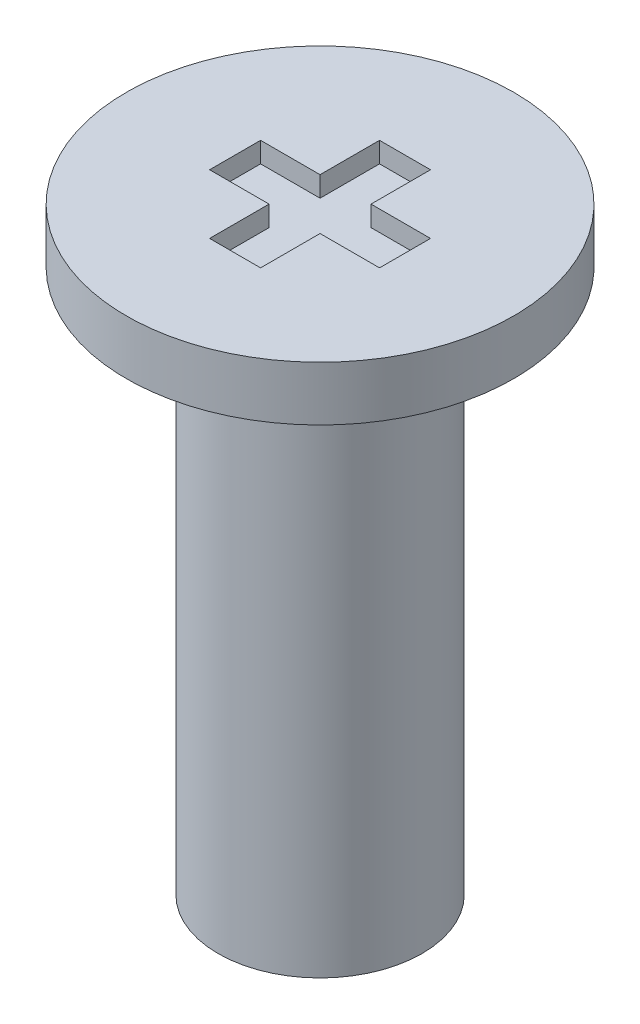
ISO-10303-21;
HEADER;
FILE_DESCRIPTION(('STEP AP214'),'2;1');
FILE_NAME('part.step','',(''),(''),'','','');
FILE_SCHEMA(('AUTOMOTIVE_DESIGN { 1 0 10303 214 1 1 1 1 }'));
ENDSEC;
DATA;
#1=APPLICATION_CONTEXT('core data for automotive mechanical design processes');
#2=APPLICATION_PROTOCOL_DEFINITION('international standard','automotive_design',2000,#1);
#3=PRODUCT_CONTEXT('',#1,'mechanical');
#4=PRODUCT('Part','Part','',(#3));
#5=PRODUCT_RELATED_PRODUCT_CATEGORY('part','',(#4));
#6=PRODUCT_DEFINITION_FORMATION('','',#4);
#7=PRODUCT_DEFINITION_CONTEXT('part definition',#1,'design');
#8=PRODUCT_DEFINITION('design','',#6,#7);
#9=PRODUCT_DEFINITION_SHAPE('','',#8);
#10=(LENGTH_UNIT() NAMED_UNIT(*) SI_UNIT(.MILLI.,.METRE.));
#11=(NAMED_UNIT(*) PLANE_ANGLE_UNIT() SI_UNIT($,.RADIAN.));
#12=(NAMED_UNIT(*) SI_UNIT($,.STERADIAN.) SOLID_ANGLE_UNIT());
#13=UNCERTAINTY_MEASURE_WITH_UNIT(LENGTH_MEASURE(1.E-05),#10,'distance_accuracy_value','');
#14=(GEOMETRIC_REPRESENTATION_CONTEXT(3) GLOBAL_UNCERTAINTY_ASSIGNED_CONTEXT((#13)) GLOBAL_UNIT_ASSIGNED_CONTEXT((#10,
#11,#12)) REPRESENTATION_CONTEXT('',''));
#15=CARTESIAN_POINT('',(0.,0.,0.));
#16=DIRECTION('',(0.,0.,1.));
#17=DIRECTION('',(1.,0.,0.));
#18=AXIS2_PLACEMENT_3D('',#15,#16,#17);
#19=CARTESIAN_POINT('',(0.,0.,0.));
#20=DIRECTION('',(0.,1.,0.));
#21=DIRECTION('',(0.,0.,1.));
#22=AXIS2_PLACEMENT_3D('',#19,#20,#21);
#23=PLANE('',#22);
#24=DIRECTION('',(-1.,0.,0.));
#25=VECTOR('',#24,1.);
#26=CARTESIAN_POINT('',(0.,0.,-0.375));
#27=LINE('',#26,#25);
#28=CARTESIAN_POINT('',(1.25,0.,-0.374999999999996));
#29=VERTEX_POINT('',#28);
#30=CARTESIAN_POINT('',(0.375,0.,-0.374999999999999));
#31=VERTEX_POINT('',#30);
#32=EDGE_CURVE('E222',#29,#31,#27,.T.);
#33=ORIENTED_EDGE('',*,*,#32,.F.);
#34=DIRECTION('',(0.,0.,-1.));
#35=VECTOR('',#34,1.);
#36=CARTESIAN_POINT('',(1.25,0.,-0.374999999999996));
#37=LINE('',#36,#35);
#38=CARTESIAN_POINT('',(1.25,0.,0.375000000000004));
#39=VERTEX_POINT('',#38);
#40=EDGE_CURVE('E149',#39,#29,#37,.T.);
#41=ORIENTED_EDGE('',*,*,#40,.F.);
#42=DIRECTION('',(1.,0.,0.));
#43=VECTOR('',#42,1.);
#44=CARTESIAN_POINT('',(0.,0.,0.375));
#45=LINE('',#44,#43);
#46=CARTESIAN_POINT('',(0.375,0.,0.375000000000004));
#47=VERTEX_POINT('',#46);
#48=EDGE_CURVE('E225',#47,#39,#45,.T.);
#49=ORIENTED_EDGE('',*,*,#48,.F.);
#50=DIRECTION('',(0.,0.,-1.));
#51=VECTOR('',#50,1.);
#52=CARTESIAN_POINT('',(0.375,0.,0.));
#53=LINE('',#52,#51);
#54=CARTESIAN_POINT('',(0.375,0.,1.25));
#55=VERTEX_POINT('',#54);
#56=EDGE_CURVE('E182',#55,#47,#53,.T.);
#57=ORIENTED_EDGE('',*,*,#56,.F.);
#58=DIRECTION('',(1.,0.,0.));
#59=VECTOR('',#58,1.);
#60=CARTESIAN_POINT('',(0.375,0.,1.25));
#61=LINE('',#60,#59);
#62=CARTESIAN_POINT('',(-0.375,0.,1.25));
#63=VERTEX_POINT('',#62);
#64=EDGE_CURVE('E187',#63,#55,#61,.T.);
#65=ORIENTED_EDGE('',*,*,#64,.F.);
#66=DIRECTION('',(0.,0.,1.));
#67=VECTOR('',#66,1.);
#68=CARTESIAN_POINT('',(-0.375,0.,0.));
#69=LINE('',#68,#67);
#70=CARTESIAN_POINT('',(-0.375,0.,0.374999999999996));
#71=VERTEX_POINT('',#70);
#72=EDGE_CURVE('E198',#71,#63,#69,.T.);
#73=ORIENTED_EDGE('',*,*,#72,.F.);
#74=DIRECTION('',(1.,0.,0.));
#75=VECTOR('',#74,1.);
#76=CARTESIAN_POINT('',(0.,0.,0.375));
#77=LINE('',#76,#75);
#78=CARTESIAN_POINT('',(-1.25,0.,0.374999999999987));
#79=VERTEX_POINT('',#78);
#80=EDGE_CURVE('E171',#79,#71,#77,.T.);
#81=ORIENTED_EDGE('',*,*,#80,.F.);
#82=DIRECTION('',(0.,0.,1.));
#83=VECTOR('',#82,1.);
#84=CARTESIAN_POINT('',(-1.25,0.,0.374999999999987));
#85=LINE('',#84,#83);
#86=CARTESIAN_POINT('',(-1.25,0.,-0.375000000000013));
#87=VERTEX_POINT('',#86);
#88=EDGE_CURVE('E168',#87,#79,#85,.T.);
#89=ORIENTED_EDGE('',*,*,#88,.F.);
#90=CARTESIAN_POINT('',(-0.375,0.,-0.375000000000001));
#91=VERTEX_POINT('',#90);
#92=EDGE_CURVE('E155',#91,#87,#27,.T.);
#93=ORIENTED_EDGE('',*,*,#92,.F.);
#94=DIRECTION('',(0.,0.,1.));
#95=VECTOR('',#94,1.);
#96=CARTESIAN_POINT('',(-0.375,0.,0.));
#97=LINE('',#96,#95);
#98=CARTESIAN_POINT('',(-0.375,0.,-1.25));
#99=VERTEX_POINT('',#98);
#100=EDGE_CURVE('E243',#99,#91,#97,.T.);
#101=ORIENTED_EDGE('',*,*,#100,.F.);
#102=DIRECTION('',(-1.,0.,0.));
#103=VECTOR('',#102,1.);
#104=CARTESIAN_POINT('',(-0.375,0.,-1.25));
#105=LINE('',#104,#103);
#106=CARTESIAN_POINT('',(0.375,0.,-1.25));
#107=VERTEX_POINT('',#106);
#108=EDGE_CURVE('E247',#107,#99,#105,.T.);
#109=ORIENTED_EDGE('',*,*,#108,.F.);
#110=DIRECTION('',(0.,0.,-1.));
#111=VECTOR('',#110,1.);
#112=CARTESIAN_POINT('',(0.375,0.,0.));
#113=LINE('',#112,#111);
#114=EDGE_CURVE('E74',#31,#107,#113,.T.);
#115=ORIENTED_EDGE('',*,*,#114,.F.);
#116=EDGE_LOOP('',(#33,#41,#49,#57,#65,#73,#81,#89,#93,#101,#109,#115));
#117=FACE_BOUND('',#116,.T.);
#118=CARTESIAN_POINT('',(0.,0.,0.));
#119=DIRECTION('',(0.,-1.,0.));
#120=DIRECTION('',(0.,0.,-1.));
#121=AXIS2_PLACEMENT_3D('',#118,#119,#120);
#122=CIRCLE('',#121,2.85);
#123=CARTESIAN_POINT('',(0.,0.,-2.85));
#124=VERTEX_POINT('',#123);
#125=EDGE_CURVE('E11',#124,#124,#122,.T.);
#126=ORIENTED_EDGE('',*,*,#125,.F.);
#127=EDGE_LOOP('',(#126));
#128=FACE_BOUND('',#127,.T.);
#129=ADVANCED_FACE('F45',(#117,#128),#23,.T.);
#130=CARTESIAN_POINT('',(0.,-8.8,0.));
#131=DIRECTION('',(0.,-1.,0.));
#132=DIRECTION('',(0.,0.,-1.));
#133=AXIS2_PLACEMENT_3D('',#130,#131,#132);
#134=CYLINDRICAL_SURFACE('',#133,2.85);
#135=ORIENTED_EDGE('',*,*,#125,.T.);
#136=EDGE_LOOP('',(#135));
#137=FACE_BOUND('',#136,.T.);
#138=CARTESIAN_POINT('',(0.,-0.8,0.));
#139=DIRECTION('',(0.,-1.,0.));
#140=DIRECTION('',(0.,0.,-1.));
#141=AXIS2_PLACEMENT_3D('',#138,#139,#140);
#142=CIRCLE('',#141,2.85);
#143=CARTESIAN_POINT('',(0.,-0.8,-2.85));
#144=VERTEX_POINT('',#143);
#145=EDGE_CURVE('E54',#144,#144,#142,.T.);
#146=ORIENTED_EDGE('',*,*,#145,.F.);
#147=EDGE_LOOP('',(#146));
#148=FACE_BOUND('',#147,.T.);
#149=ADVANCED_FACE('F279',(#137,#148),#134,.T.);
#150=CARTESIAN_POINT('',(2.85,-0.8,0.));
#151=DIRECTION('',(0.,-1.,0.));
#152=DIRECTION('',(0.,0.,-1.));
#153=AXIS2_PLACEMENT_3D('',#150,#151,#152);
#154=PLANE('',#153);
#155=ORIENTED_EDGE('',*,*,#145,.T.);
#156=EDGE_LOOP('',(#155));
#157=FACE_BOUND('',#156,.T.);
#158=CARTESIAN_POINT('',(0.,-0.8,0.));
#159=DIRECTION('',(0.,-1.,0.));
#160=DIRECTION('',(0.,0.,-1.));
#161=AXIS2_PLACEMENT_3D('',#158,#159,#160);
#162=CIRCLE('',#161,1.5);
#163=CARTESIAN_POINT('',(0.,-0.8,-1.5));
#164=VERTEX_POINT('',#163);
#165=EDGE_CURVE('E269',#164,#164,#162,.T.);
#166=ORIENTED_EDGE('',*,*,#165,.F.);
#167=EDGE_LOOP('',(#166));
#168=FACE_BOUND('',#167,.T.);
#169=ADVANCED_FACE('F276',(#157,#168),#154,.T.);
#170=CARTESIAN_POINT('',(0.,-8.8,0.));
#171=DIRECTION('',(0.,-1.,0.));
#172=DIRECTION('',(0.,0.,-1.));
#173=AXIS2_PLACEMENT_3D('',#170,#171,#172);
#174=CYLINDRICAL_SURFACE('',#173,1.5);
#175=ORIENTED_EDGE('',*,*,#165,.T.);
#176=EDGE_LOOP('',(#175));
#177=FACE_BOUND('',#176,.T.);
#178=CARTESIAN_POINT('',(0.,-8.8,0.));
#179=DIRECTION('',(0.,-1.,0.));
#180=DIRECTION('',(0.,0.,-1.));
#181=AXIS2_PLACEMENT_3D('',#178,#179,#180);
#182=CIRCLE('',#181,1.5);
#183=CARTESIAN_POINT('',(0.,-8.8,-1.5));
#184=VERTEX_POINT('',#183);
#185=EDGE_CURVE('E263',#184,#184,#182,.T.);
#186=ORIENTED_EDGE('',*,*,#185,.F.);
#187=EDGE_LOOP('',(#186));
#188=FACE_BOUND('',#187,.T.);
#189=ADVANCED_FACE('F286',(#177,#188),#174,.T.);
#190=CARTESIAN_POINT('',(1.5,-8.8,0.));
#191=DIRECTION('',(0.,-1.,0.));
#192=DIRECTION('',(0.,0.,-1.));
#193=AXIS2_PLACEMENT_3D('',#190,#191,#192);
#194=PLANE('',#193);
#195=ORIENTED_EDGE('',*,*,#185,.T.);
#196=EDGE_LOOP('',(#195));
#197=FACE_BOUND('',#196,.T.);
#198=ADVANCED_FACE('F292',(#197),#194,.T.);
#199=CARTESIAN_POINT('',(-0.375,-0.3,0.));
#200=DIRECTION('',(-1.,0.,0.));
#201=DIRECTION('',(0.,-1.,0.));
#202=AXIS2_PLACEMENT_3D('',#199,#200,#201);
#203=PLANE('',#202);
#204=ORIENTED_EDGE('',*,*,#100,.T.);
#205=DIRECTION('',(0.,-1.,0.));
#206=VECTOR('',#205,1.);
#207=CARTESIAN_POINT('',(-0.375,-0.3,-0.375000000000001));
#208=LINE('',#207,#206);
#209=CARTESIAN_POINT('',(-0.375,-0.3,-0.375000000000001));
#210=VERTEX_POINT('',#209);
#211=EDGE_CURVE('E240',#91,#210,#208,.T.);
#212=ORIENTED_EDGE('',*,*,#211,.T.);
#213=DIRECTION('',(0.,0.,1.));
#214=VECTOR('',#213,1.);
#215=CARTESIAN_POINT('',(-0.375,-0.3,0.));
#216=LINE('',#215,#214);
#217=CARTESIAN_POINT('',(-0.375,-0.3,-1.25));
#218=VERTEX_POINT('',#217);
#219=EDGE_CURVE('E146',#218,#210,#216,.T.);
#220=ORIENTED_EDGE('',*,*,#219,.F.);
#221=DIRECTION('',(0.,1.,0.));
#222=VECTOR('',#221,1.);
#223=CARTESIAN_POINT('',(-0.375,-0.3,-1.25));
#224=LINE('',#223,#222);
#225=EDGE_CURVE('E62',#218,#99,#224,.T.);
#226=ORIENTED_EDGE('',*,*,#225,.T.);
#227=EDGE_LOOP('',(#204,#212,#220,#226));
#228=FACE_BOUND('',#227,.T.);
#229=ADVANCED_FACE('F296',(#228),#203,.F.);
#230=CARTESIAN_POINT('',(-0.375,-0.3,-1.25));
#231=DIRECTION('',(0.,0.,-1.));
#232=DIRECTION('',(-1.,0.,0.));
#233=AXIS2_PLACEMENT_3D('',#230,#231,#232);
#234=PLANE('',#233);
#235=ORIENTED_EDGE('',*,*,#108,.T.);
#236=ORIENTED_EDGE('',*,*,#225,.F.);
#237=DIRECTION('',(-1.,0.,0.));
#238=VECTOR('',#237,1.);
#239=CARTESIAN_POINT('',(-0.375,-0.3,-1.25));
#240=LINE('',#239,#238);
#241=CARTESIAN_POINT('',(0.375,-0.3,-1.25));
#242=VERTEX_POINT('',#241);
#243=EDGE_CURVE('E250',#242,#218,#240,.T.);
#244=ORIENTED_EDGE('',*,*,#243,.F.);
#245=DIRECTION('',(0.,1.,0.));
#246=VECTOR('',#245,1.);
#247=CARTESIAN_POINT('',(0.375,-0.3,-1.25));
#248=LINE('',#247,#246);
#249=EDGE_CURVE('E253',#242,#107,#248,.T.);
#250=ORIENTED_EDGE('',*,*,#249,.T.);
#251=EDGE_LOOP('',(#235,#236,#244,#250));
#252=FACE_BOUND('',#251,.T.);
#253=ADVANCED_FACE('F300',(#252),#234,.F.);
#254=CARTESIAN_POINT('',(0.375,-0.3,0.));
#255=DIRECTION('',(1.,0.,0.));
#256=DIRECTION('',(0.,1.,0.));
#257=AXIS2_PLACEMENT_3D('',#254,#255,#256);
#258=PLANE('',#257);
#259=DIRECTION('',(0.,0.,-1.));
#260=VECTOR('',#259,1.);
#261=CARTESIAN_POINT('',(0.375,-0.3,0.));
#262=LINE('',#261,#260);
#263=CARTESIAN_POINT('',(0.375,-0.3,-0.374999999999999));
#264=VERTEX_POINT('',#263);
#265=EDGE_CURVE('E246',#264,#242,#262,.T.);
#266=ORIENTED_EDGE('',*,*,#265,.F.);
#267=DIRECTION('',(0.,1.,0.));
#268=VECTOR('',#267,1.);
#269=CARTESIAN_POINT('',(0.375,-0.3,-0.374999999999999));
#270=LINE('',#269,#268);
#271=EDGE_CURVE('E234',#264,#31,#270,.T.);
#272=ORIENTED_EDGE('',*,*,#271,.T.);
#273=ORIENTED_EDGE('',*,*,#114,.T.);
#274=ORIENTED_EDGE('',*,*,#249,.F.);
#275=EDGE_LOOP('',(#266,#272,#273,#274));
#276=FACE_BOUND('',#275,.T.);
#277=ADVANCED_FACE('F302',(#276),#258,.F.);
#278=CARTESIAN_POINT('',(0.,-0.3,0.));
#279=DIRECTION('',(0.,-1.,0.));
#280=DIRECTION('',(1.,0.,0.));
#281=AXIS2_PLACEMENT_3D('',#278,#279,#280);
#282=PLANE('',#281);
#283=DIRECTION('',(-1.,0.,0.));
#284=VECTOR('',#283,1.);
#285=CARTESIAN_POINT('',(0.,-0.3,-0.375));
#286=LINE('',#285,#284);
#287=CARTESIAN_POINT('',(1.25,-0.3,-0.374999999999996));
#288=VERTEX_POINT('',#287);
#289=EDGE_CURVE('E148',#288,#264,#286,.T.);
#290=ORIENTED_EDGE('',*,*,#289,.T.);
#291=ORIENTED_EDGE('',*,*,#265,.T.);
#292=ORIENTED_EDGE('',*,*,#243,.T.);
#293=ORIENTED_EDGE('',*,*,#219,.T.);
#294=CARTESIAN_POINT('',(-1.25,-0.3,-0.375000000000013));
#295=VERTEX_POINT('',#294);
#296=EDGE_CURVE('E82',#210,#295,#286,.T.);
#297=ORIENTED_EDGE('',*,*,#296,.T.);
#298=DIRECTION('',(0.,0.,1.));
#299=VECTOR('',#298,1.);
#300=CARTESIAN_POINT('',(-1.25,-0.3,0.374999999999987));
#301=LINE('',#300,#299);
#302=CARTESIAN_POINT('',(-1.25,-0.3,0.374999999999987));
#303=VERTEX_POINT('',#302);
#304=EDGE_CURVE('E144',#295,#303,#301,.T.);
#305=ORIENTED_EDGE('',*,*,#304,.T.);
#306=DIRECTION('',(1.,0.,0.));
#307=VECTOR('',#306,1.);
#308=CARTESIAN_POINT('',(0.,-0.3,0.375));
#309=LINE('',#308,#307);
#310=CARTESIAN_POINT('',(-0.375,-0.3,0.374999999999996));
#311=VERTEX_POINT('',#310);
#312=EDGE_CURVE('E165',#303,#311,#309,.T.);
#313=ORIENTED_EDGE('',*,*,#312,.T.);
#314=DIRECTION('',(0.,0.,1.));
#315=VECTOR('',#314,1.);
#316=CARTESIAN_POINT('',(-0.375,-0.3,0.));
#317=LINE('',#316,#315);
#318=CARTESIAN_POINT('',(-0.375,-0.3,1.25));
#319=VERTEX_POINT('',#318);
#320=EDGE_CURVE('E186',#311,#319,#317,.T.);
#321=ORIENTED_EDGE('',*,*,#320,.T.);
#322=DIRECTION('',(1.,0.,0.));
#323=VECTOR('',#322,1.);
#324=CARTESIAN_POINT('',(0.375,-0.3,1.25));
#325=LINE('',#324,#323);
#326=CARTESIAN_POINT('',(0.375,-0.3,1.25));
#327=VERTEX_POINT('',#326);
#328=EDGE_CURVE('E190',#319,#327,#325,.T.);
#329=ORIENTED_EDGE('',*,*,#328,.T.);
#330=DIRECTION('',(0.,0.,-1.));
#331=VECTOR('',#330,1.);
#332=CARTESIAN_POINT('',(0.375,-0.3,0.));
#333=LINE('',#332,#331);
#334=CARTESIAN_POINT('',(0.375,-0.3,0.375000000000004));
#335=VERTEX_POINT('',#334);
#336=EDGE_CURVE('E183',#327,#335,#333,.T.);
#337=ORIENTED_EDGE('',*,*,#336,.T.);
#338=DIRECTION('',(1.,0.,0.));
#339=VECTOR('',#338,1.);
#340=CARTESIAN_POINT('',(0.,-0.3,0.375));
#341=LINE('',#340,#339);
#342=CARTESIAN_POINT('',(1.25,-0.3,0.375000000000004));
#343=VERTEX_POINT('',#342);
#344=EDGE_CURVE('E214',#335,#343,#341,.T.);
#345=ORIENTED_EDGE('',*,*,#344,.T.);
#346=DIRECTION('',(0.,0.,-1.));
#347=VECTOR('',#346,1.);
#348=CARTESIAN_POINT('',(1.25,-0.3,-0.374999999999996));
#349=LINE('',#348,#347);
#350=EDGE_CURVE('E217',#343,#288,#349,.T.);
#351=ORIENTED_EDGE('',*,*,#350,.T.);
#352=EDGE_LOOP('',(#290,#291,#292,#293,#297,#305,#313,#321,#329,#337,#345,#351));
#353=FACE_BOUND('',#352,.T.);
#354=ADVANCED_FACE('F142',(#353),#282,.F.);
#355=CARTESIAN_POINT('',(0.,-0.3,-0.375));
#356=DIRECTION('',(0.,0.,-1.));
#357=DIRECTION('',(-1.,0.,0.));
#358=AXIS2_PLACEMENT_3D('',#355,#356,#357);
#359=PLANE('',#358);
#360=ORIENTED_EDGE('',*,*,#92,.T.);
#361=DIRECTION('',(0.,1.,0.));
#362=VECTOR('',#361,1.);
#363=CARTESIAN_POINT('',(-1.25,-0.3,-0.375000000000013));
#364=LINE('',#363,#362);
#365=EDGE_CURVE('E152',#295,#87,#364,.T.);
#366=ORIENTED_EDGE('',*,*,#365,.F.);
#367=ORIENTED_EDGE('',*,*,#296,.F.);
#368=ORIENTED_EDGE('',*,*,#211,.F.);
#369=EDGE_LOOP('',(#360,#366,#367,#368));
#370=FACE_BOUND('',#369,.T.);
#371=ADVANCED_FACE('F153',(#370),#359,.F.);
#372=ORIENTED_EDGE('',*,*,#289,.F.);
#373=DIRECTION('',(0.,1.,0.));
#374=VECTOR('',#373,1.);
#375=CARTESIAN_POINT('',(1.25,-0.3,-0.374999999999996));
#376=LINE('',#375,#374);
#377=EDGE_CURVE('E231',#288,#29,#376,.T.);
#378=ORIENTED_EDGE('',*,*,#377,.T.);
#379=ORIENTED_EDGE('',*,*,#32,.T.);
#380=ORIENTED_EDGE('',*,*,#271,.F.);
#381=EDGE_LOOP('',(#372,#378,#379,#380));
#382=FACE_BOUND('',#381,.T.);
#383=ADVANCED_FACE('F311',(#382),#359,.F.);
#384=CARTESIAN_POINT('',(1.25,-0.3,-0.374999999999996));
#385=DIRECTION('',(1.,0.,0.));
#386=DIRECTION('',(0.,0.,-1.));
#387=AXIS2_PLACEMENT_3D('',#384,#385,#386);
#388=PLANE('',#387);
#389=ORIENTED_EDGE('',*,*,#40,.T.);
#390=ORIENTED_EDGE('',*,*,#377,.F.);
#391=ORIENTED_EDGE('',*,*,#350,.F.);
#392=DIRECTION('',(0.,1.,0.));
#393=VECTOR('',#392,1.);
#394=CARTESIAN_POINT('',(1.25,-0.3,0.375000000000004));
#395=LINE('',#394,#393);
#396=EDGE_CURVE('E221',#343,#39,#395,.T.);
#397=ORIENTED_EDGE('',*,*,#396,.T.);
#398=EDGE_LOOP('',(#389,#390,#391,#397));
#399=FACE_BOUND('',#398,.T.);
#400=ADVANCED_FACE('F316',(#399),#388,.F.);
#401=CARTESIAN_POINT('',(0.,-0.3,0.375));
#402=DIRECTION('',(0.,0.,1.));
#403=DIRECTION('',(1.,0.,0.));
#404=AXIS2_PLACEMENT_3D('',#401,#402,#403);
#405=PLANE('',#404);
#406=DIRECTION('',(0.,1.,0.));
#407=VECTOR('',#406,1.);
#408=CARTESIAN_POINT('',(0.375,-0.3,0.375000000000001));
#409=LINE('',#408,#407);
#410=EDGE_CURVE('E207',#335,#47,#409,.T.);
#411=ORIENTED_EDGE('',*,*,#410,.T.);
#412=ORIENTED_EDGE('',*,*,#48,.T.);
#413=ORIENTED_EDGE('',*,*,#396,.F.);
#414=ORIENTED_EDGE('',*,*,#344,.F.);
#415=EDGE_LOOP('',(#411,#412,#413,#414));
#416=FACE_BOUND('',#415,.T.);
#417=ADVANCED_FACE('F312',(#416),#405,.F.);
#418=CARTESIAN_POINT('',(0.375,-0.3,0.));
#419=DIRECTION('',(1.,0.,0.));
#420=DIRECTION('',(0.,1.,0.));
#421=AXIS2_PLACEMENT_3D('',#418,#419,#420);
#422=PLANE('',#421);
#423=ORIENTED_EDGE('',*,*,#336,.F.);
#424=DIRECTION('',(0.,1.,0.));
#425=VECTOR('',#424,1.);
#426=CARTESIAN_POINT('',(0.375,-0.3,1.25));
#427=LINE('',#426,#425);
#428=EDGE_CURVE('E204',#327,#55,#427,.T.);
#429=ORIENTED_EDGE('',*,*,#428,.T.);
#430=ORIENTED_EDGE('',*,*,#56,.T.);
#431=ORIENTED_EDGE('',*,*,#410,.F.);
#432=EDGE_LOOP('',(#423,#429,#430,#431));
#433=FACE_BOUND('',#432,.T.);
#434=ADVANCED_FACE('F315',(#433),#422,.F.);
#435=CARTESIAN_POINT('',(0.375,-0.3,1.25));
#436=DIRECTION('',(0.,0.,1.));
#437=DIRECTION('',(1.,0.,0.));
#438=AXIS2_PLACEMENT_3D('',#435,#436,#437);
#439=PLANE('',#438);
#440=ORIENTED_EDGE('',*,*,#64,.T.);
#441=ORIENTED_EDGE('',*,*,#428,.F.);
#442=ORIENTED_EDGE('',*,*,#328,.F.);
#443=DIRECTION('',(0.,1.,0.));
#444=VECTOR('',#443,1.);
#445=CARTESIAN_POINT('',(-0.375,-0.3,1.25));
#446=LINE('',#445,#444);
#447=EDGE_CURVE('E194',#319,#63,#446,.T.);
#448=ORIENTED_EDGE('',*,*,#447,.T.);
#449=EDGE_LOOP('',(#440,#441,#442,#448));
#450=FACE_BOUND('',#449,.T.);
#451=ADVANCED_FACE('F323',(#450),#439,.F.);
#452=CARTESIAN_POINT('',(-0.375,-0.3,0.));
#453=DIRECTION('',(-1.,0.,0.));
#454=DIRECTION('',(0.,-1.,0.));
#455=AXIS2_PLACEMENT_3D('',#452,#453,#454);
#456=PLANE('',#455);
#457=DIRECTION('',(0.,1.,0.));
#458=VECTOR('',#457,1.);
#459=CARTESIAN_POINT('',(-0.375,-0.3,0.374999999999996));
#460=LINE('',#459,#458);
#461=EDGE_CURVE('E178',#311,#71,#460,.T.);
#462=ORIENTED_EDGE('',*,*,#461,.T.);
#463=ORIENTED_EDGE('',*,*,#72,.T.);
#464=ORIENTED_EDGE('',*,*,#447,.F.);
#465=ORIENTED_EDGE('',*,*,#320,.F.);
#466=EDGE_LOOP('',(#462,#463,#464,#465));
#467=FACE_BOUND('',#466,.T.);
#468=ADVANCED_FACE('F325',(#467),#456,.F.);
#469=CARTESIAN_POINT('',(0.,-0.3,0.375));
#470=DIRECTION('',(0.,0.,1.));
#471=DIRECTION('',(1.,0.,0.));
#472=AXIS2_PLACEMENT_3D('',#469,#470,#471);
#473=PLANE('',#472);
#474=ORIENTED_EDGE('',*,*,#312,.F.);
#475=DIRECTION('',(0.,1.,0.));
#476=VECTOR('',#475,1.);
#477=CARTESIAN_POINT('',(-1.25,-0.3,0.374999999999987));
#478=LINE('',#477,#476);
#479=EDGE_CURVE('E160',#303,#79,#478,.T.);
#480=ORIENTED_EDGE('',*,*,#479,.T.);
#481=ORIENTED_EDGE('',*,*,#80,.T.);
#482=ORIENTED_EDGE('',*,*,#461,.F.);
#483=EDGE_LOOP('',(#474,#480,#481,#482));
#484=FACE_BOUND('',#483,.T.);
#485=ADVANCED_FACE('F328',(#484),#473,.F.);
#486=CARTESIAN_POINT('',(-1.25,-0.3,0.374999999999987));
#487=DIRECTION('',(-1.,0.,0.));
#488=DIRECTION('',(0.,0.,1.));
#489=AXIS2_PLACEMENT_3D('',#486,#487,#488);
#490=PLANE('',#489);
#491=ORIENTED_EDGE('',*,*,#88,.T.);
#492=ORIENTED_EDGE('',*,*,#479,.F.);
#493=ORIENTED_EDGE('',*,*,#304,.F.);
#494=ORIENTED_EDGE('',*,*,#365,.T.);
#495=EDGE_LOOP('',(#491,#492,#493,#494));
#496=FACE_BOUND('',#495,.T.);
#497=ADVANCED_FACE('F162',(#496),#490,.F.);
#498=CLOSED_SHELL('',(#129,#149,#169,#189,#198,#229,#253,#277,#354,#371,#383,#400,#417,#434,
#451,#468,#485,#497));
#499=MANIFOLD_SOLID_BREP('B2',#498);
#500=ADVANCED_BREP_SHAPE_REPRESENTATION('',(#18,#499),#14);
#501=SHAPE_DEFINITION_REPRESENTATION(#9,#500);
ENDSEC;
END-ISO-10303-21;
